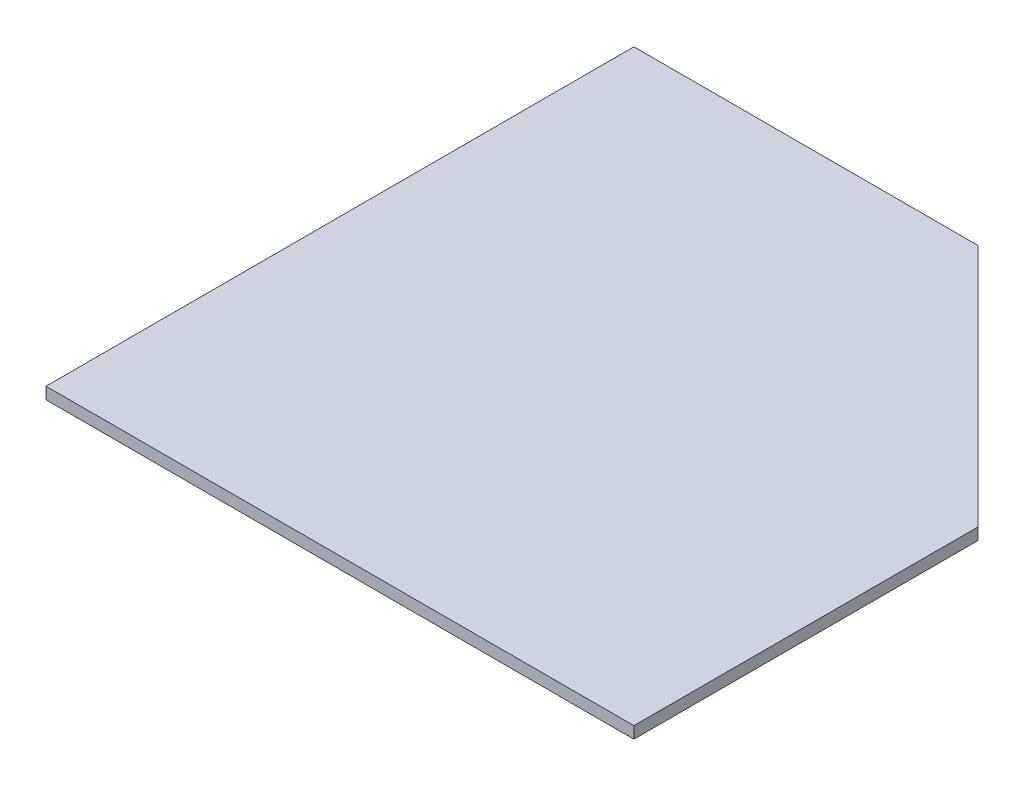
ISO-10303-21;
HEADER;
FILE_DESCRIPTION(('STEP AP214'),'2;1');
FILE_NAME('part.step','',(''),(''),'','','');
FILE_SCHEMA(('AUTOMOTIVE_DESIGN { 1 0 10303 214 1 1 1 1 }'));
ENDSEC;
DATA;
#1=APPLICATION_CONTEXT('core data for automotive mechanical design processes');
#2=APPLICATION_PROTOCOL_DEFINITION('international standard','automotive_design',2000,#1);
#3=PRODUCT_CONTEXT('',#1,'mechanical');
#4=PRODUCT('Part','Part','',(#3));
#5=PRODUCT_RELATED_PRODUCT_CATEGORY('part','',(#4));
#6=PRODUCT_DEFINITION_FORMATION('','',#4);
#7=PRODUCT_DEFINITION_CONTEXT('part definition',#1,'design');
#8=PRODUCT_DEFINITION('design','',#6,#7);
#9=PRODUCT_DEFINITION_SHAPE('','',#8);
#10=(LENGTH_UNIT() NAMED_UNIT(*) SI_UNIT(.MILLI.,.METRE.));
#11=(NAMED_UNIT(*) PLANE_ANGLE_UNIT() SI_UNIT($,.RADIAN.));
#12=(NAMED_UNIT(*) SI_UNIT($,.STERADIAN.) SOLID_ANGLE_UNIT());
#13=UNCERTAINTY_MEASURE_WITH_UNIT(LENGTH_MEASURE(1.E-05),#10,'distance_accuracy_value','');
#14=(GEOMETRIC_REPRESENTATION_CONTEXT(3) GLOBAL_UNCERTAINTY_ASSIGNED_CONTEXT((#13)) GLOBAL_UNIT_ASSIGNED_CONTEXT((#10,
#11,#12)) REPRESENTATION_CONTEXT('',''));
#15=CARTESIAN_POINT('',(0.,0.,0.));
#16=DIRECTION('',(0.,0.,1.));
#17=DIRECTION('',(1.,0.,0.));
#18=AXIS2_PLACEMENT_3D('',#15,#16,#17);
#19=CARTESIAN_POINT('',(100.,4.,-100.));
#20=DIRECTION('',(-1.,0.,0.));
#21=DIRECTION('',(0.,0.,1.));
#22=AXIS2_PLACEMENT_3D('',#19,#20,#21);
#23=PLANE('',#22);
#24=DIRECTION('',(0.,0.,-1.));
#25=VECTOR('',#24,1.);
#26=CARTESIAN_POINT('',(100.,0.,-100.));
#27=LINE('',#26,#25);
#28=CARTESIAN_POINT('',(100.,0.,100.));
#29=VERTEX_POINT('',#28);
#30=CARTESIAN_POINT('',(100.,0.,-17.0620125646201));
#31=VERTEX_POINT('',#30);
#32=EDGE_CURVE('E103',#29,#31,#27,.T.);
#33=ORIENTED_EDGE('',*,*,#32,.T.);
#34=DIRECTION('',(0.,1.,0.));
#35=VECTOR('',#34,1.);
#36=CARTESIAN_POINT('',(100.,4.,-17.0620125646201));
#37=LINE('',#36,#35);
#38=CARTESIAN_POINT('',(100.,4.,-17.0620125646201));
#39=VERTEX_POINT('',#38);
#40=EDGE_CURVE('E50',#31,#39,#37,.T.);
#41=ORIENTED_EDGE('',*,*,#40,.T.);
#42=DIRECTION('',(0.,0.,-1.));
#43=VECTOR('',#42,1.);
#44=CARTESIAN_POINT('',(100.,4.,-100.));
#45=LINE('',#44,#43);
#46=CARTESIAN_POINT('',(100.,4.,100.));
#47=VERTEX_POINT('',#46);
#48=EDGE_CURVE('E111',#47,#39,#45,.T.);
#49=ORIENTED_EDGE('',*,*,#48,.F.);
#50=DIRECTION('',(0.,-1.,0.));
#51=VECTOR('',#50,1.);
#52=CARTESIAN_POINT('',(100.,4.,100.));
#53=LINE('',#52,#51);
#54=EDGE_CURVE('E112',#47,#29,#53,.T.);
#55=ORIENTED_EDGE('',*,*,#54,.T.);
#56=EDGE_LOOP('',(#33,#41,#49,#55));
#57=FACE_BOUND('',#56,.T.);
#58=ADVANCED_FACE('F36',(#57),#23,.F.);
#59=CARTESIAN_POINT('',(-100.,4.,-100.));
#60=DIRECTION('',(0.,0.,1.));
#61=DIRECTION('',(1.,0.,0.));
#62=AXIS2_PLACEMENT_3D('',#59,#60,#61);
#63=PLANE('',#62);
#64=DIRECTION('',(-1.,0.,0.));
#65=VECTOR('',#64,1.);
#66=CARTESIAN_POINT('',(-100.,4.,-100.));
#67=LINE('',#66,#65);
#68=CARTESIAN_POINT('',(17.062012564621,4.,-100.));
#69=VERTEX_POINT('',#68);
#70=CARTESIAN_POINT('',(-100.,4.,-100.));
#71=VERTEX_POINT('',#70);
#72=EDGE_CURVE('E80',#69,#71,#67,.T.);
#73=ORIENTED_EDGE('',*,*,#72,.F.);
#74=DIRECTION('',(0.,-1.,0.));
#75=VECTOR('',#74,1.);
#76=CARTESIAN_POINT('',(17.062012564621,4.,-100.));
#77=LINE('',#76,#75);
#78=CARTESIAN_POINT('',(17.062012564621,0.,-100.));
#79=VERTEX_POINT('',#78);
#80=EDGE_CURVE('E90',#69,#79,#77,.T.);
#81=ORIENTED_EDGE('',*,*,#80,.T.);
#82=DIRECTION('',(-1.,0.,0.));
#83=VECTOR('',#82,1.);
#84=CARTESIAN_POINT('',(-100.,0.,-100.));
#85=LINE('',#84,#83);
#86=CARTESIAN_POINT('',(-100.,0.,-100.));
#87=VERTEX_POINT('',#86);
#88=EDGE_CURVE('E97',#79,#87,#85,.T.);
#89=ORIENTED_EDGE('',*,*,#88,.T.);
#90=DIRECTION('',(0.,-1.,0.));
#91=VECTOR('',#90,1.);
#92=CARTESIAN_POINT('',(-100.,4.,-100.));
#93=LINE('',#92,#91);
#94=EDGE_CURVE('E43',#71,#87,#93,.T.);
#95=ORIENTED_EDGE('',*,*,#94,.F.);
#96=EDGE_LOOP('',(#73,#81,#89,#95));
#97=FACE_BOUND('',#96,.T.);
#98=ADVANCED_FACE('F96',(#97),#63,.F.);
#99=CARTESIAN_POINT('',(-100.,4.,-100.));
#100=DIRECTION('',(1.,0.,0.));
#101=DIRECTION('',(0.,0.,-1.));
#102=AXIS2_PLACEMENT_3D('',#99,#100,#101);
#103=PLANE('',#102);
#104=DIRECTION('',(0.,0.,1.));
#105=VECTOR('',#104,1.);
#106=CARTESIAN_POINT('',(-100.,0.,-100.));
#107=LINE('',#106,#105);
#108=CARTESIAN_POINT('',(-99.9999999999999,0.,100.));
#109=VERTEX_POINT('',#108);
#110=EDGE_CURVE('E102',#87,#109,#107,.T.);
#111=ORIENTED_EDGE('',*,*,#110,.T.);
#112=DIRECTION('',(0.,-1.,0.));
#113=VECTOR('',#112,1.);
#114=CARTESIAN_POINT('',(-99.9999999999999,4.,100.));
#115=LINE('',#114,#113);
#116=CARTESIAN_POINT('',(-99.9999999999999,4.,100.));
#117=VERTEX_POINT('',#116);
#118=EDGE_CURVE('E114',#117,#109,#115,.T.);
#119=ORIENTED_EDGE('',*,*,#118,.F.);
#120=DIRECTION('',(0.,0.,1.));
#121=VECTOR('',#120,1.);
#122=CARTESIAN_POINT('',(-100.,4.,-100.));
#123=LINE('',#122,#121);
#124=EDGE_CURVE('E119',#71,#117,#123,.T.);
#125=ORIENTED_EDGE('',*,*,#124,.F.);
#126=ORIENTED_EDGE('',*,*,#94,.T.);
#127=EDGE_LOOP('',(#111,#119,#125,#126));
#128=FACE_BOUND('',#127,.T.);
#129=ADVANCED_FACE('F117',(#128),#103,.F.);
#130=CARTESIAN_POINT('',(-99.9999999999999,4.,100.));
#131=DIRECTION('',(0.,0.,-1.));
#132=DIRECTION('',(-1.,0.,0.));
#133=AXIS2_PLACEMENT_3D('',#130,#131,#132);
#134=PLANE('',#133);
#135=DIRECTION('',(1.,0.,0.));
#136=VECTOR('',#135,1.);
#137=CARTESIAN_POINT('',(-99.9999999999999,0.,100.));
#138=LINE('',#137,#136);
#139=EDGE_CURVE('E75',#109,#29,#138,.T.);
#140=ORIENTED_EDGE('',*,*,#139,.T.);
#141=ORIENTED_EDGE('',*,*,#54,.F.);
#142=DIRECTION('',(1.,0.,0.));
#143=VECTOR('',#142,1.);
#144=CARTESIAN_POINT('',(-99.9999999999999,4.,100.));
#145=LINE('',#144,#143);
#146=EDGE_CURVE('E58',#117,#47,#145,.T.);
#147=ORIENTED_EDGE('',*,*,#146,.F.);
#148=ORIENTED_EDGE('',*,*,#118,.T.);
#149=EDGE_LOOP('',(#140,#141,#147,#148));
#150=FACE_BOUND('',#149,.T.);
#151=ADVANCED_FACE('F129',(#150),#134,.F.);
#152=CARTESIAN_POINT('',(0.,4.,0.));
#153=DIRECTION('',(0.,1.,0.));
#154=DIRECTION('',(0.,0.,1.));
#155=AXIS2_PLACEMENT_3D('',#152,#153,#154);
#156=PLANE('',#155);
#157=DIRECTION('',(0.707106781186544,0.,0.707106781186551));
#158=VECTOR('',#157,1.);
#159=CARTESIAN_POINT('',(58.5310062823106,4.,-58.53100628231));
#160=LINE('',#159,#158);
#161=EDGE_CURVE('E106',#69,#39,#160,.T.);
#162=ORIENTED_EDGE('',*,*,#161,.F.);
#163=ORIENTED_EDGE('',*,*,#72,.T.);
#164=ORIENTED_EDGE('',*,*,#124,.T.);
#165=ORIENTED_EDGE('',*,*,#146,.T.);
#166=ORIENTED_EDGE('',*,*,#48,.T.);
#167=EDGE_LOOP('',(#162,#163,#164,#165,#166));
#168=FACE_BOUND('',#167,.T.);
#169=ADVANCED_FACE('F127',(#168),#156,.T.);
#170=CARTESIAN_POINT('',(0.,0.,0.));
#171=DIRECTION('',(0.,1.,0.));
#172=DIRECTION('',(0.,0.,1.));
#173=AXIS2_PLACEMENT_3D('',#170,#171,#172);
#174=PLANE('',#173);
#175=ORIENTED_EDGE('',*,*,#88,.F.);
#176=DIRECTION('',(0.707106781186544,0.,0.707106781186551));
#177=VECTOR('',#176,1.);
#178=CARTESIAN_POINT('',(58.5310062823106,0.,-58.53100628231));
#179=LINE('',#178,#177);
#180=EDGE_CURVE('E11',#79,#31,#179,.T.);
#181=ORIENTED_EDGE('',*,*,#180,.T.);
#182=ORIENTED_EDGE('',*,*,#32,.F.);
#183=ORIENTED_EDGE('',*,*,#139,.F.);
#184=ORIENTED_EDGE('',*,*,#110,.F.);
#185=EDGE_LOOP('',(#175,#181,#182,#183,#184));
#186=FACE_BOUND('',#185,.T.);
#187=ADVANCED_FACE('F101',(#186),#174,.F.);
#188=CARTESIAN_POINT('',(207.718866814116,362.588744164743,90.6568542494969));
#189=DIRECTION('',(-0.707106781186551,0.,0.707106781186544));
#190=DIRECTION('',(0.707106781186544,0.,0.707106781186551));
#191=AXIS2_PLACEMENT_3D('',#188,#189,#190);
#192=PLANE('',#191);
#193=ORIENTED_EDGE('',*,*,#80,.F.);
#194=ORIENTED_EDGE('',*,*,#161,.T.);
#195=ORIENTED_EDGE('',*,*,#40,.F.);
#196=ORIENTED_EDGE('',*,*,#180,.F.);
#197=EDGE_LOOP('',(#193,#194,#195,#196));
#198=FACE_BOUND('',#197,.T.);
#199=ADVANCED_FACE('F89',(#198),#192,.F.);
#200=CLOSED_SHELL('',(#58,#98,#129,#151,#169,#187,#199));
#201=MANIFOLD_SOLID_BREP('B2',#200);
#202=ADVANCED_BREP_SHAPE_REPRESENTATION('',(#18,#201),#14);
#203=SHAPE_DEFINITION_REPRESENTATION(#9,#202);
ENDSEC;
END-ISO-10303-21;
